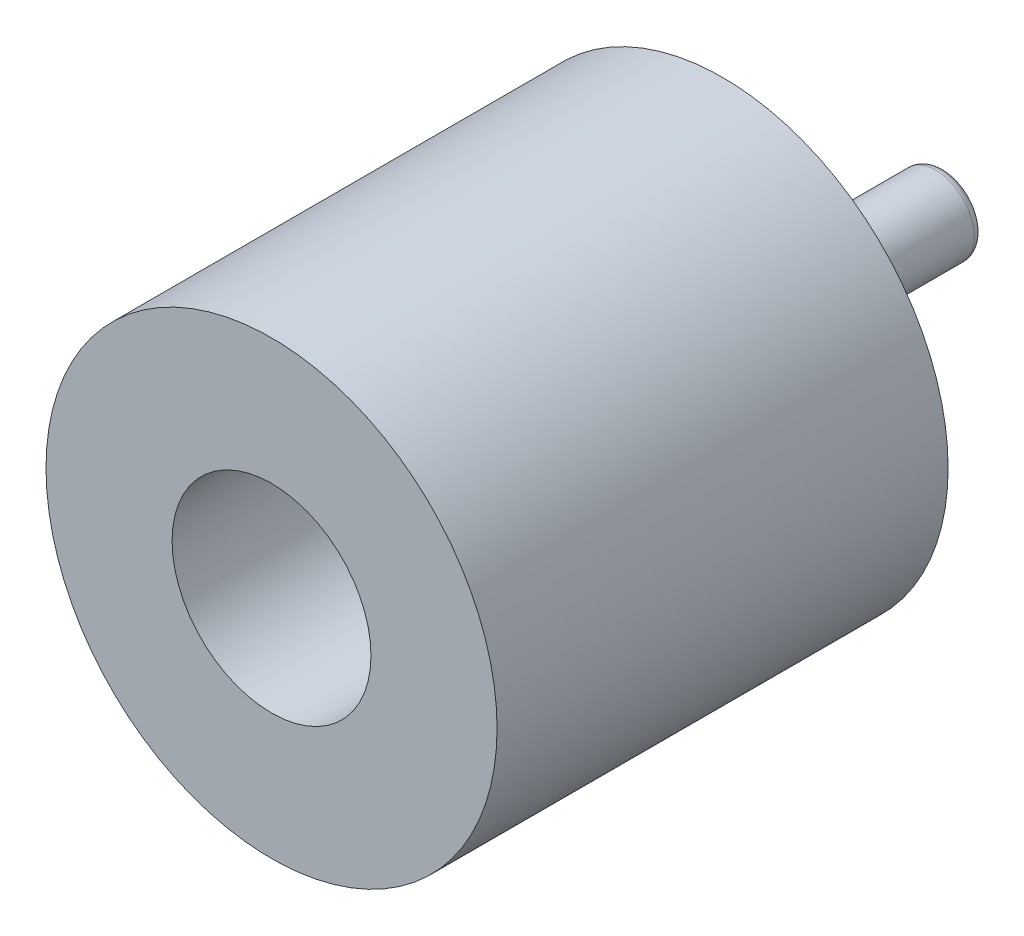
ISO-10303-21;
HEADER;
FILE_DESCRIPTION(('STEP AP214'),'2;1');
FILE_NAME('part.step','',(''),(''),'','','');
FILE_SCHEMA(('AUTOMOTIVE_DESIGN { 1 0 10303 214 1 1 1 1 }'));
ENDSEC;
DATA;
#1=APPLICATION_CONTEXT('core data for automotive mechanical design processes');
#2=APPLICATION_PROTOCOL_DEFINITION('international standard','automotive_design',2000,#1);
#3=PRODUCT_CONTEXT('',#1,'mechanical');
#4=PRODUCT('Part','Part','',(#3));
#5=PRODUCT_RELATED_PRODUCT_CATEGORY('part','',(#4));
#6=PRODUCT_DEFINITION_FORMATION('','',#4);
#7=PRODUCT_DEFINITION_CONTEXT('part definition',#1,'design');
#8=PRODUCT_DEFINITION('design','',#6,#7);
#9=PRODUCT_DEFINITION_SHAPE('','',#8);
#10=(LENGTH_UNIT() NAMED_UNIT(*) SI_UNIT(.MILLI.,.METRE.));
#11=(NAMED_UNIT(*) PLANE_ANGLE_UNIT() SI_UNIT($,.RADIAN.));
#12=(NAMED_UNIT(*) SI_UNIT($,.STERADIAN.) SOLID_ANGLE_UNIT());
#13=UNCERTAINTY_MEASURE_WITH_UNIT(LENGTH_MEASURE(1.E-05),#10,'distance_accuracy_value','');
#14=(GEOMETRIC_REPRESENTATION_CONTEXT(3) GLOBAL_UNCERTAINTY_ASSIGNED_CONTEXT((#13)) GLOBAL_UNIT_ASSIGNED_CONTEXT((#10,
#11,#12)) REPRESENTATION_CONTEXT('',''));
#15=CARTESIAN_POINT('',(0.,0.,0.));
#16=DIRECTION('',(0.,0.,1.));
#17=DIRECTION('',(1.,0.,0.));
#18=AXIS2_PLACEMENT_3D('',#15,#16,#17);
#19=CARTESIAN_POINT('',(0.,0.,5.08));
#20=DIRECTION('',(0.,0.,-1.));
#21=DIRECTION('',(-1.,0.,0.));
#22=AXIS2_PLACEMENT_3D('',#19,#20,#21);
#23=CYLINDRICAL_SURFACE('',#22,2.54);
#24=CARTESIAN_POINT('',(0.,0.,5.08));
#25=DIRECTION('',(0.,0.,1.));
#26=DIRECTION('',(1.,0.,0.));
#27=AXIS2_PLACEMENT_3D('',#24,#25,#26);
#28=CIRCLE('',#27,2.54);
#29=CARTESIAN_POINT('',(2.54,0.,5.08));
#30=VERTEX_POINT('',#29);
#31=EDGE_CURVE('E52',#30,#30,#28,.T.);
#32=ORIENTED_EDGE('',*,*,#31,.F.);
#33=EDGE_LOOP('',(#32));
#34=FACE_BOUND('',#33,.T.);
#35=CARTESIAN_POINT('',(0.,0.,0.));
#36=DIRECTION('',(0.,0.,1.));
#37=DIRECTION('',(1.,0.,0.));
#38=AXIS2_PLACEMENT_3D('',#35,#36,#37);
#39=CIRCLE('',#38,2.54);
#40=CARTESIAN_POINT('',(2.54,0.,0.));
#41=VERTEX_POINT('',#40);
#42=EDGE_CURVE('E53',#41,#41,#39,.T.);
#43=ORIENTED_EDGE('',*,*,#42,.T.);
#44=EDGE_LOOP('',(#43));
#45=FACE_BOUND('',#44,.T.);
#46=ADVANCED_FACE('F32',(#34,#45),#23,.T.);
#47=CARTESIAN_POINT('',(0.,0.,5.08));
#48=DIRECTION('',(0.,0.,1.));
#49=DIRECTION('',(1.,0.,0.));
#50=AXIS2_PLACEMENT_3D('',#47,#48,#49);
#51=PLANE('',#50);
#52=CARTESIAN_POINT('',(0.,0.,5.08));
#53=DIRECTION('',(0.,0.,1.));
#54=DIRECTION('',(1.,0.,0.));
#55=AXIS2_PLACEMENT_3D('',#52,#53,#54);
#56=CIRCLE('',#55,1.12);
#57=CARTESIAN_POINT('',(1.12,0.,5.08));
#58=VERTEX_POINT('',#57);
#59=EDGE_CURVE('E59',#58,#58,#56,.T.);
#60=ORIENTED_EDGE('',*,*,#59,.F.);
#61=EDGE_LOOP('',(#60));
#62=FACE_BOUND('',#61,.T.);
#63=ORIENTED_EDGE('',*,*,#31,.T.);
#64=EDGE_LOOP('',(#63));
#65=FACE_BOUND('',#64,.T.);
#66=ADVANCED_FACE('F74',(#62,#65),#51,.T.);
#67=CARTESIAN_POINT('',(0.,0.,0.));
#68=DIRECTION('',(0.,0.,1.));
#69=DIRECTION('',(1.,0.,0.));
#70=AXIS2_PLACEMENT_3D('',#67,#68,#69);
#71=PLANE('',#70);
#72=CARTESIAN_POINT('',(0.,0.,0.));
#73=DIRECTION('',(0.,0.,1.));
#74=DIRECTION('',(1.,0.,0.));
#75=AXIS2_PLACEMENT_3D('',#72,#73,#74);
#76=CIRCLE('',#75,0.535);
#77=CARTESIAN_POINT('',(0.535,0.,0.));
#78=VERTEX_POINT('',#77);
#79=EDGE_CURVE('E43',#78,#78,#76,.T.);
#80=ORIENTED_EDGE('',*,*,#79,.T.);
#81=EDGE_LOOP('',(#80));
#82=FACE_BOUND('',#81,.T.);
#83=ORIENTED_EDGE('',*,*,#42,.F.);
#84=EDGE_LOOP('',(#83));
#85=FACE_BOUND('',#84,.T.);
#86=ADVANCED_FACE('F70',(#82,#85),#71,.F.);
#87=CARTESIAN_POINT('',(0.,0.,2.08));
#88=DIRECTION('',(0.,0.,1.));
#89=DIRECTION('',(1.,0.,0.));
#90=AXIS2_PLACEMENT_3D('',#87,#88,#89);
#91=CYLINDRICAL_SURFACE('',#90,1.12);
#92=CARTESIAN_POINT('',(0.,0.,2.08));
#93=DIRECTION('',(0.,0.,1.));
#94=DIRECTION('',(1.,0.,0.));
#95=AXIS2_PLACEMENT_3D('',#92,#93,#94);
#96=CIRCLE('',#95,1.12);
#97=CARTESIAN_POINT('',(1.12,0.,2.08));
#98=VERTEX_POINT('',#97);
#99=EDGE_CURVE('E56',#98,#98,#96,.T.);
#100=ORIENTED_EDGE('',*,*,#99,.F.);
#101=EDGE_LOOP('',(#100));
#102=FACE_BOUND('',#101,.T.);
#103=ORIENTED_EDGE('',*,*,#59,.T.);
#104=EDGE_LOOP('',(#103));
#105=FACE_BOUND('',#104,.T.);
#106=ADVANCED_FACE('F67',(#102,#105),#91,.F.);
#107=CARTESIAN_POINT('',(0.,0.,2.08));
#108=DIRECTION('',(0.,0.,1.));
#109=DIRECTION('',(1.,0.,0.));
#110=AXIS2_PLACEMENT_3D('',#107,#108,#109);
#111=PLANE('',#110);
#112=ORIENTED_EDGE('',*,*,#99,.T.);
#113=EDGE_LOOP('',(#112));
#114=FACE_BOUND('',#113,.T.);
#115=ADVANCED_FACE('F65',(#114),#111,.T.);
#116=CARTESIAN_POINT('',(0.,0.,-2.5));
#117=DIRECTION('',(0.,0.,1.));
#118=DIRECTION('',(1.,0.,0.));
#119=AXIS2_PLACEMENT_3D('',#116,#117,#118);
#120=CYLINDRICAL_SURFACE('',#119,0.435);
#121=CARTESIAN_POINT('',(0.,0.,-2.4));
#122=DIRECTION('',(0.,0.,-1.));
#123=DIRECTION('',(-1.,0.,0.));
#124=AXIS2_PLACEMENT_3D('',#121,#122,#123);
#125=CIRCLE('',#124,0.435);
#126=CARTESIAN_POINT('',(-0.435,0.,-2.4));
#127=VERTEX_POINT('',#126);
#128=EDGE_CURVE('E10',#127,#127,#125,.F.);
#129=ORIENTED_EDGE('',*,*,#128,.T.);
#130=EDGE_LOOP('',(#129));
#131=FACE_BOUND('',#130,.T.);
#132=CARTESIAN_POINT('',(0.,0.,-0.0999999999999998));
#133=DIRECTION('',(0.,0.,1.));
#134=DIRECTION('',(1.,0.,0.));
#135=AXIS2_PLACEMENT_3D('',#132,#133,#134);
#136=CIRCLE('',#135,0.435);
#137=CARTESIAN_POINT('',(0.435,0.,-0.0999999999999998));
#138=VERTEX_POINT('',#137);
#139=EDGE_CURVE('E47',#138,#138,#136,.F.);
#140=ORIENTED_EDGE('',*,*,#139,.T.);
#141=EDGE_LOOP('',(#140));
#142=FACE_BOUND('',#141,.T.);
#143=ADVANCED_FACE('F99',(#131,#142),#120,.T.);
#144=CARTESIAN_POINT('',(0.,0.,-2.5));
#145=DIRECTION('',(0.,0.,-1.));
#146=DIRECTION('',(-1.,0.,0.));
#147=AXIS2_PLACEMENT_3D('',#144,#145,#146);
#148=PLANE('',#147);
#149=CARTESIAN_POINT('',(0.,0.,-2.5));
#150=DIRECTION('',(0.,0.,-1.));
#151=DIRECTION('',(-1.,0.,0.));
#152=AXIS2_PLACEMENT_3D('',#149,#150,#151);
#153=CIRCLE('',#152,0.335);
#154=CARTESIAN_POINT('',(-0.335,0.,-2.5));
#155=VERTEX_POINT('',#154);
#156=EDGE_CURVE('E39',#155,#155,#153,.T.);
#157=ORIENTED_EDGE('',*,*,#156,.T.);
#158=EDGE_LOOP('',(#157));
#159=FACE_BOUND('',#158,.T.);
#160=ADVANCED_FACE('F92',(#159),#148,.T.);
#161=CARTESIAN_POINT('',(0.,0.,-0.0999999999999998));
#162=DIRECTION('',(0.,0.,1.));
#163=DIRECTION('',(1.,0.,0.));
#164=AXIS2_PLACEMENT_3D('',#161,#162,#163);
#165=TOROIDAL_SURFACE('',#164,0.535,0.1);
#166=ORIENTED_EDGE('',*,*,#79,.F.);
#167=EDGE_LOOP('',(#166));
#168=FACE_BOUND('',#167,.T.);
#169=ORIENTED_EDGE('',*,*,#139,.F.);
#170=EDGE_LOOP('',(#169));
#171=FACE_BOUND('',#170,.T.);
#172=ADVANCED_FACE('F90',(#168,#171),#165,.F.);
#173=CARTESIAN_POINT('',(0.,0.,-2.4));
#174=DIRECTION('',(0.,0.,-1.));
#175=DIRECTION('',(-1.,0.,0.));
#176=AXIS2_PLACEMENT_3D('',#173,#174,#175);
#177=TOROIDAL_SURFACE('',#176,0.335,0.1);
#178=ORIENTED_EDGE('',*,*,#128,.F.);
#179=EDGE_LOOP('',(#178));
#180=FACE_BOUND('',#179,.T.);
#181=ORIENTED_EDGE('',*,*,#156,.F.);
#182=EDGE_LOOP('',(#181));
#183=FACE_BOUND('',#182,.T.);
#184=ADVANCED_FACE('F34',(#180,#183),#177,.T.);
#185=CLOSED_SHELL('',(#46,#66,#86,#106,#115,#143,#160,#172,#184));
#186=MANIFOLD_SOLID_BREP('B2',#185);
#187=ADVANCED_BREP_SHAPE_REPRESENTATION('',(#18,#186),#14);
#188=SHAPE_DEFINITION_REPRESENTATION(#9,#187);
ENDSEC;
END-ISO-10303-21;
